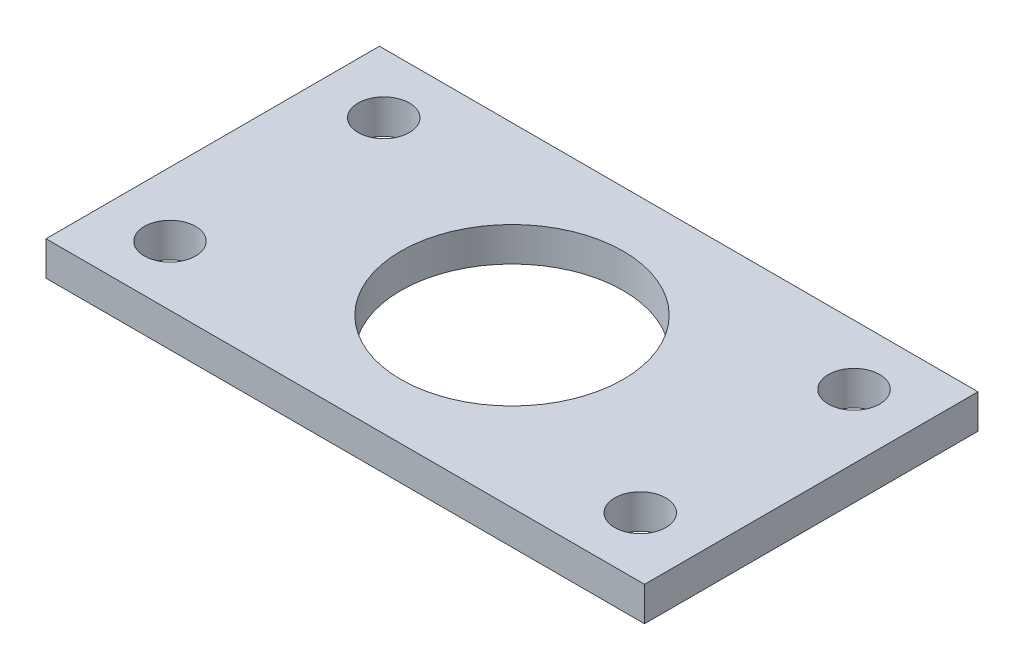
ISO-10303-21;
HEADER;
FILE_DESCRIPTION(('STEP AP214'),'2;1');
FILE_NAME('part.step','',(''),(''),'','','');
FILE_SCHEMA(('AUTOMOTIVE_DESIGN { 1 0 10303 214 1 1 1 1 }'));
ENDSEC;
DATA;
#1=APPLICATION_CONTEXT('core data for automotive mechanical design processes');
#2=APPLICATION_PROTOCOL_DEFINITION('international standard','automotive_design',2000,#1);
#3=PRODUCT_CONTEXT('',#1,'mechanical');
#4=PRODUCT('Part','Part','',(#3));
#5=PRODUCT_RELATED_PRODUCT_CATEGORY('part','',(#4));
#6=PRODUCT_DEFINITION_FORMATION('','',#4);
#7=PRODUCT_DEFINITION_CONTEXT('part definition',#1,'design');
#8=PRODUCT_DEFINITION('design','',#6,#7);
#9=PRODUCT_DEFINITION_SHAPE('','',#8);
#10=(LENGTH_UNIT() NAMED_UNIT(*) SI_UNIT(.MILLI.,.METRE.));
#11=(NAMED_UNIT(*) PLANE_ANGLE_UNIT() SI_UNIT($,.RADIAN.));
#12=(NAMED_UNIT(*) SI_UNIT($,.STERADIAN.) SOLID_ANGLE_UNIT());
#13=UNCERTAINTY_MEASURE_WITH_UNIT(LENGTH_MEASURE(1.E-05),#10,'distance_accuracy_value','');
#14=(GEOMETRIC_REPRESENTATION_CONTEXT(3) GLOBAL_UNCERTAINTY_ASSIGNED_CONTEXT((#13)) GLOBAL_UNIT_ASSIGNED_CONTEXT((#10,
#11,#12)) REPRESENTATION_CONTEXT('',''));
#15=CARTESIAN_POINT('',(0.,0.,0.));
#16=DIRECTION('',(0.,0.,1.));
#17=DIRECTION('',(1.,0.,0.));
#18=AXIS2_PLACEMENT_3D('',#15,#16,#17);
#19=CARTESIAN_POINT('',(70.,-4.,39.));
#20=DIRECTION('',(0.,1.,0.));
#21=DIRECTION('',(0.,0.,1.));
#22=AXIS2_PLACEMENT_3D('',#19,#20,#21);
#23=PLANE('',#22);
#24=CARTESIAN_POINT('',(62.5,-4.,32.));
#25=DIRECTION('',(0.,1.,0.));
#26=DIRECTION('',(0.,0.,1.));
#27=AXIS2_PLACEMENT_3D('',#24,#25,#26);
#28=CIRCLE('',#27,3.00000000000001);
#29=CARTESIAN_POINT('',(62.5,-4.,35.));
#30=VERTEX_POINT('',#29);
#31=EDGE_CURVE('E117',#30,#30,#28,.T.);
#32=ORIENTED_EDGE('',*,*,#31,.T.);
#33=EDGE_LOOP('',(#32));
#34=FACE_BOUND('',#33,.T.);
#35=CARTESIAN_POINT('',(35.,-4.,19.5));
#36=DIRECTION('',(0.,1.,0.));
#37=DIRECTION('',(0.,0.,1.));
#38=AXIS2_PLACEMENT_3D('',#35,#36,#37);
#39=CIRCLE('',#38,13.);
#40=CARTESIAN_POINT('',(35.,-4.,32.5));
#41=VERTEX_POINT('',#40);
#42=EDGE_CURVE('E123',#41,#41,#39,.T.);
#43=ORIENTED_EDGE('',*,*,#42,.T.);
#44=EDGE_LOOP('',(#43));
#45=FACE_BOUND('',#44,.T.);
#46=CARTESIAN_POINT('',(7.5,-4.,7.));
#47=DIRECTION('',(0.,1.,0.));
#48=DIRECTION('',(0.,0.,1.));
#49=AXIS2_PLACEMENT_3D('',#46,#47,#48);
#50=CIRCLE('',#49,3.);
#51=CARTESIAN_POINT('',(7.5,-4.,10.));
#52=VERTEX_POINT('',#51);
#53=EDGE_CURVE('E126',#52,#52,#50,.T.);
#54=ORIENTED_EDGE('',*,*,#53,.T.);
#55=EDGE_LOOP('',(#54));
#56=FACE_BOUND('',#55,.T.);
#57=DIRECTION('',(1.,0.,0.));
#58=VECTOR('',#57,1.);
#59=CARTESIAN_POINT('',(70.,-4.,0.));
#60=LINE('',#59,#58);
#61=CARTESIAN_POINT('',(0.,-4.,0.));
#62=VERTEX_POINT('',#61);
#63=CARTESIAN_POINT('',(70.,-4.,0.));
#64=VERTEX_POINT('',#63);
#65=EDGE_CURVE('E92',#62,#64,#60,.T.);
#66=ORIENTED_EDGE('',*,*,#65,.T.);
#67=DIRECTION('',(0.,0.,-1.));
#68=VECTOR('',#67,1.);
#69=CARTESIAN_POINT('',(70.,-4.,39.));
#70=LINE('',#69,#68);
#71=CARTESIAN_POINT('',(70.,-4.,39.));
#72=VERTEX_POINT('',#71);
#73=EDGE_CURVE('E45',#72,#64,#70,.T.);
#74=ORIENTED_EDGE('',*,*,#73,.F.);
#75=DIRECTION('',(1.,0.,0.));
#76=VECTOR('',#75,1.);
#77=CARTESIAN_POINT('',(70.,-4.,39.));
#78=LINE('',#77,#76);
#79=CARTESIAN_POINT('',(0.,-4.,39.));
#80=VERTEX_POINT('',#79);
#81=EDGE_CURVE('E83',#80,#72,#78,.T.);
#82=ORIENTED_EDGE('',*,*,#81,.F.);
#83=DIRECTION('',(0.,0.,-1.));
#84=VECTOR('',#83,1.);
#85=CARTESIAN_POINT('',(0.,-4.,39.));
#86=LINE('',#85,#84);
#87=EDGE_CURVE('E11',#80,#62,#86,.T.);
#88=ORIENTED_EDGE('',*,*,#87,.T.);
#89=EDGE_LOOP('',(#66,#74,#82,#88));
#90=FACE_BOUND('',#89,.T.);
#91=CARTESIAN_POINT('',(62.5,-4.,7.));
#92=DIRECTION('',(0.,1.,0.));
#93=DIRECTION('',(0.,0.,1.));
#94=AXIS2_PLACEMENT_3D('',#91,#92,#93);
#95=CIRCLE('',#94,3.00000000000001);
#96=CARTESIAN_POINT('',(62.5,-4.,10.));
#97=VERTEX_POINT('',#96);
#98=EDGE_CURVE('E120',#97,#97,#95,.F.);
#99=ORIENTED_EDGE('',*,*,#98,.F.);
#100=EDGE_LOOP('',(#99));
#101=FACE_BOUND('',#100,.T.);
#102=CARTESIAN_POINT('',(7.5,-4.,32.));
#103=DIRECTION('',(0.,1.,0.));
#104=DIRECTION('',(0.,0.,1.));
#105=AXIS2_PLACEMENT_3D('',#102,#103,#104);
#106=CIRCLE('',#105,3.);
#107=CARTESIAN_POINT('',(7.5,-4.,35.));
#108=VERTEX_POINT('',#107);
#109=EDGE_CURVE('E103',#108,#108,#106,.F.);
#110=ORIENTED_EDGE('',*,*,#109,.F.);
#111=EDGE_LOOP('',(#110));
#112=FACE_BOUND('',#111,.T.);
#113=ADVANCED_FACE('F36',(#34,#45,#56,#90,#101,#112),#23,.F.);
#114=CARTESIAN_POINT('',(0.,0.,39.));
#115=DIRECTION('',(0.,-1.,0.));
#116=DIRECTION('',(0.,0.,-1.));
#117=AXIS2_PLACEMENT_3D('',#114,#115,#116);
#118=PLANE('',#117);
#119=CARTESIAN_POINT('',(62.5,0.,32.));
#120=DIRECTION('',(0.,1.,0.));
#121=DIRECTION('',(0.,0.,1.));
#122=AXIS2_PLACEMENT_3D('',#119,#120,#121);
#123=CIRCLE('',#122,3.00000000000001);
#124=CARTESIAN_POINT('',(62.5,0.,35.));
#125=VERTEX_POINT('',#124);
#126=EDGE_CURVE('E133',#125,#125,#123,.T.);
#127=ORIENTED_EDGE('',*,*,#126,.F.);
#128=EDGE_LOOP('',(#127));
#129=FACE_BOUND('',#128,.T.);
#130=CARTESIAN_POINT('',(35.,0.,19.5));
#131=DIRECTION('',(0.,1.,0.));
#132=DIRECTION('',(0.,0.,1.));
#133=AXIS2_PLACEMENT_3D('',#130,#131,#132);
#134=CIRCLE('',#133,13.);
#135=CARTESIAN_POINT('',(35.,0.,32.5));
#136=VERTEX_POINT('',#135);
#137=EDGE_CURVE('E139',#136,#136,#134,.T.);
#138=ORIENTED_EDGE('',*,*,#137,.F.);
#139=EDGE_LOOP('',(#138));
#140=FACE_BOUND('',#139,.T.);
#141=CARTESIAN_POINT('',(7.5,0.,7.));
#142=DIRECTION('',(0.,1.,0.));
#143=DIRECTION('',(0.,0.,1.));
#144=AXIS2_PLACEMENT_3D('',#141,#142,#143);
#145=CIRCLE('',#144,3.);
#146=CARTESIAN_POINT('',(7.5,0.,10.));
#147=VERTEX_POINT('',#146);
#148=EDGE_CURVE('E129',#147,#147,#145,.T.);
#149=ORIENTED_EDGE('',*,*,#148,.F.);
#150=EDGE_LOOP('',(#149));
#151=FACE_BOUND('',#150,.T.);
#152=DIRECTION('',(-1.,0.,0.));
#153=VECTOR('',#152,1.);
#154=CARTESIAN_POINT('',(0.,0.,0.));
#155=LINE('',#154,#153);
#156=CARTESIAN_POINT('',(70.,0.,0.));
#157=VERTEX_POINT('',#156);
#158=CARTESIAN_POINT('',(0.,0.,0.));
#159=VERTEX_POINT('',#158);
#160=EDGE_CURVE('E76',#157,#159,#155,.T.);
#161=ORIENTED_EDGE('',*,*,#160,.T.);
#162=DIRECTION('',(0.,0.,-1.));
#163=VECTOR('',#162,1.);
#164=CARTESIAN_POINT('',(0.,0.,39.));
#165=LINE('',#164,#163);
#166=CARTESIAN_POINT('',(0.,0.,39.));
#167=VERTEX_POINT('',#166);
#168=EDGE_CURVE('E96',#167,#159,#165,.T.);
#169=ORIENTED_EDGE('',*,*,#168,.F.);
#170=DIRECTION('',(-1.,0.,0.));
#171=VECTOR('',#170,1.);
#172=CARTESIAN_POINT('',(0.,0.,39.));
#173=LINE('',#172,#171);
#174=CARTESIAN_POINT('',(70.,0.,39.));
#175=VERTEX_POINT('',#174);
#176=EDGE_CURVE('E53',#175,#167,#173,.T.);
#177=ORIENTED_EDGE('',*,*,#176,.F.);
#178=DIRECTION('',(0.,0.,-1.));
#179=VECTOR('',#178,1.);
#180=CARTESIAN_POINT('',(70.,0.,39.));
#181=LINE('',#180,#179);
#182=EDGE_CURVE('E93',#175,#157,#181,.T.);
#183=ORIENTED_EDGE('',*,*,#182,.T.);
#184=EDGE_LOOP('',(#161,#169,#177,#183));
#185=FACE_BOUND('',#184,.T.);
#186=CARTESIAN_POINT('',(62.5,0.,7.));
#187=DIRECTION('',(0.,1.,0.));
#188=DIRECTION('',(0.,0.,1.));
#189=AXIS2_PLACEMENT_3D('',#186,#187,#188);
#190=CIRCLE('',#189,3.00000000000001);
#191=CARTESIAN_POINT('',(62.5,0.,10.));
#192=VERTEX_POINT('',#191);
#193=EDGE_CURVE('E136',#192,#192,#190,.F.);
#194=ORIENTED_EDGE('',*,*,#193,.T.);
#195=EDGE_LOOP('',(#194));
#196=FACE_BOUND('',#195,.T.);
#197=CARTESIAN_POINT('',(7.5,0.,32.));
#198=DIRECTION('',(0.,1.,0.));
#199=DIRECTION('',(0.,0.,1.));
#200=AXIS2_PLACEMENT_3D('',#197,#198,#199);
#201=CIRCLE('',#200,3.);
#202=CARTESIAN_POINT('',(7.5,0.,35.));
#203=VERTEX_POINT('',#202);
#204=EDGE_CURVE('E132',#203,#203,#201,.F.);
#205=ORIENTED_EDGE('',*,*,#204,.T.);
#206=EDGE_LOOP('',(#205));
#207=FACE_BOUND('',#206,.T.);
#208=ADVANCED_FACE('F108',(#129,#140,#151,#185,#196,#207),#118,.F.);
#209=CARTESIAN_POINT('',(0.,-4.,39.));
#210=DIRECTION('',(1.,0.,0.));
#211=DIRECTION('',(0.,0.,-1.));
#212=AXIS2_PLACEMENT_3D('',#209,#210,#211);
#213=PLANE('',#212);
#214=DIRECTION('',(0.,-1.,0.));
#215=VECTOR('',#214,1.);
#216=CARTESIAN_POINT('',(0.,-4.,0.));
#217=LINE('',#216,#215);
#218=EDGE_CURVE('E100',#159,#62,#217,.T.);
#219=ORIENTED_EDGE('',*,*,#218,.T.);
#220=ORIENTED_EDGE('',*,*,#87,.F.);
#221=DIRECTION('',(0.,-1.,0.));
#222=VECTOR('',#221,1.);
#223=CARTESIAN_POINT('',(0.,-4.,39.));
#224=LINE('',#223,#222);
#225=EDGE_CURVE('E88',#167,#80,#224,.T.);
#226=ORIENTED_EDGE('',*,*,#225,.F.);
#227=ORIENTED_EDGE('',*,*,#168,.T.);
#228=EDGE_LOOP('',(#219,#220,#226,#227));
#229=FACE_BOUND('',#228,.T.);
#230=ADVANCED_FACE('F38',(#229),#213,.F.);
#231=CARTESIAN_POINT('',(70.,0.,39.));
#232=DIRECTION('',(-1.,0.,0.));
#233=DIRECTION('',(0.,0.,1.));
#234=AXIS2_PLACEMENT_3D('',#231,#232,#233);
#235=PLANE('',#234);
#236=DIRECTION('',(0.,1.,0.));
#237=VECTOR('',#236,1.);
#238=CARTESIAN_POINT('',(70.,0.,0.));
#239=LINE('',#238,#237);
#240=EDGE_CURVE('E70',#64,#157,#239,.T.);
#241=ORIENTED_EDGE('',*,*,#240,.T.);
#242=ORIENTED_EDGE('',*,*,#182,.F.);
#243=DIRECTION('',(0.,1.,0.));
#244=VECTOR('',#243,1.);
#245=CARTESIAN_POINT('',(70.,0.,39.));
#246=LINE('',#245,#244);
#247=EDGE_CURVE('E86',#72,#175,#246,.T.);
#248=ORIENTED_EDGE('',*,*,#247,.F.);
#249=ORIENTED_EDGE('',*,*,#73,.T.);
#250=EDGE_LOOP('',(#241,#242,#248,#249));
#251=FACE_BOUND('',#250,.T.);
#252=ADVANCED_FACE('F94',(#251),#235,.F.);
#253=CARTESIAN_POINT('',(0.,0.,39.));
#254=DIRECTION('',(0.,0.,-1.));
#255=DIRECTION('',(-1.,0.,0.));
#256=AXIS2_PLACEMENT_3D('',#253,#254,#255);
#257=PLANE('',#256);
#258=ORIENTED_EDGE('',*,*,#225,.T.);
#259=ORIENTED_EDGE('',*,*,#81,.T.);
#260=ORIENTED_EDGE('',*,*,#247,.T.);
#261=ORIENTED_EDGE('',*,*,#176,.T.);
#262=EDGE_LOOP('',(#258,#259,#260,#261));
#263=FACE_BOUND('',#262,.T.);
#264=ADVANCED_FACE('F84',(#263),#257,.F.);
#265=CARTESIAN_POINT('',(0.,0.,0.));
#266=DIRECTION('',(0.,0.,-1.));
#267=DIRECTION('',(-1.,0.,0.));
#268=AXIS2_PLACEMENT_3D('',#265,#266,#267);
#269=PLANE('',#268);
#270=ORIENTED_EDGE('',*,*,#218,.F.);
#271=ORIENTED_EDGE('',*,*,#160,.F.);
#272=ORIENTED_EDGE('',*,*,#240,.F.);
#273=ORIENTED_EDGE('',*,*,#65,.F.);
#274=EDGE_LOOP('',(#270,#271,#272,#273));
#275=FACE_BOUND('',#274,.T.);
#276=ADVANCED_FACE('F112',(#275),#269,.T.);
#277=CARTESIAN_POINT('',(7.5,-5.,7.));
#278=DIRECTION('',(0.,1.,0.));
#279=DIRECTION('',(0.,0.,1.));
#280=AXIS2_PLACEMENT_3D('',#277,#278,#279);
#281=CYLINDRICAL_SURFACE('',#280,3.);
#282=ORIENTED_EDGE('',*,*,#148,.T.);
#283=EDGE_LOOP('',(#282));
#284=FACE_BOUND('',#283,.T.);
#285=ORIENTED_EDGE('',*,*,#53,.F.);
#286=EDGE_LOOP('',(#285));
#287=FACE_BOUND('',#286,.T.);
#288=ADVANCED_FACE('F170',(#284,#287),#281,.F.);
#289=CARTESIAN_POINT('',(35.,-5.,19.5));
#290=DIRECTION('',(0.,1.,0.));
#291=DIRECTION('',(0.,0.,1.));
#292=AXIS2_PLACEMENT_3D('',#289,#290,#291);
#293=CYLINDRICAL_SURFACE('',#292,13.);
#294=ORIENTED_EDGE('',*,*,#137,.T.);
#295=EDGE_LOOP('',(#294));
#296=FACE_BOUND('',#295,.T.);
#297=ORIENTED_EDGE('',*,*,#42,.F.);
#298=EDGE_LOOP('',(#297));
#299=FACE_BOUND('',#298,.T.);
#300=ADVANCED_FACE('F150',(#296,#299),#293,.F.);
#301=CARTESIAN_POINT('',(62.5,-5.,7.));
#302=DIRECTION('',(0.,1.,0.));
#303=DIRECTION('',(0.,0.,1.));
#304=AXIS2_PLACEMENT_3D('',#301,#302,#303);
#305=CYLINDRICAL_SURFACE('',#304,3.00000000000001);
#306=ORIENTED_EDGE('',*,*,#193,.F.);
#307=EDGE_LOOP('',(#306));
#308=FACE_BOUND('',#307,.T.);
#309=ORIENTED_EDGE('',*,*,#98,.T.);
#310=EDGE_LOOP('',(#309));
#311=FACE_BOUND('',#310,.T.);
#312=ADVANCED_FACE('F146',(#308,#311),#305,.F.);
#313=CARTESIAN_POINT('',(62.5,-5.,32.));
#314=DIRECTION('',(0.,1.,0.));
#315=DIRECTION('',(0.,0.,1.));
#316=AXIS2_PLACEMENT_3D('',#313,#314,#315);
#317=CYLINDRICAL_SURFACE('',#316,3.00000000000001);
#318=ORIENTED_EDGE('',*,*,#126,.T.);
#319=EDGE_LOOP('',(#318));
#320=FACE_BOUND('',#319,.T.);
#321=ORIENTED_EDGE('',*,*,#31,.F.);
#322=EDGE_LOOP('',(#321));
#323=FACE_BOUND('',#322,.T.);
#324=ADVANCED_FACE('F149',(#320,#323),#317,.F.);
#325=CARTESIAN_POINT('',(7.5,-5.,32.));
#326=DIRECTION('',(0.,1.,0.));
#327=DIRECTION('',(0.,0.,1.));
#328=AXIS2_PLACEMENT_3D('',#325,#326,#327);
#329=CYLINDRICAL_SURFACE('',#328,3.);
#330=ORIENTED_EDGE('',*,*,#204,.F.);
#331=EDGE_LOOP('',(#330));
#332=FACE_BOUND('',#331,.T.);
#333=ORIENTED_EDGE('',*,*,#109,.T.);
#334=EDGE_LOOP('',(#333));
#335=FACE_BOUND('',#334,.T.);
#336=ADVANCED_FACE('F158',(#332,#335),#329,.F.);
#337=CLOSED_SHELL('',(#113,#208,#230,#252,#264,#276,#288,#300,#312,#324,#336));
#338=MANIFOLD_SOLID_BREP('B2',#337);
#339=ADVANCED_BREP_SHAPE_REPRESENTATION('',(#18,#338),#14);
#340=SHAPE_DEFINITION_REPRESENTATION(#9,#339);
ENDSEC;
END-ISO-10303-21;
